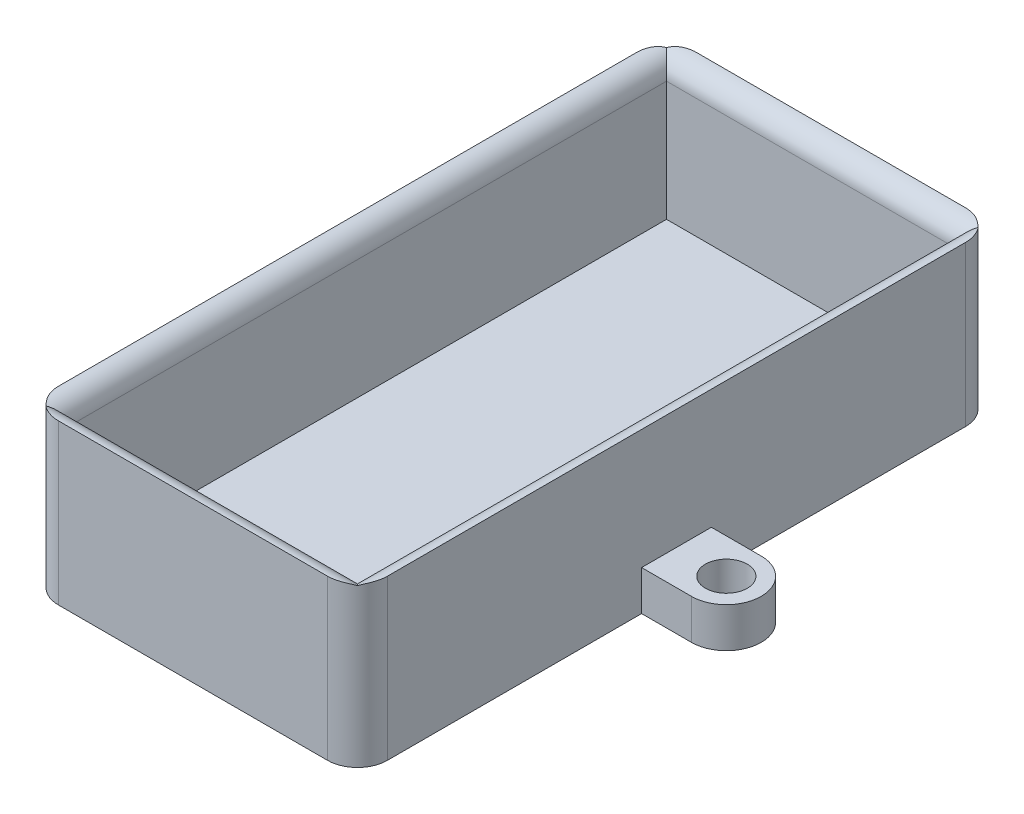
ISO-10303-21;
HEADER;
FILE_DESCRIPTION(('STEP AP214'),'2;1');
FILE_NAME('part.step','',(''),(''),'','','');
FILE_SCHEMA(('AUTOMOTIVE_DESIGN { 1 0 10303 214 1 1 1 1 }'));
ENDSEC;
DATA;
#1=APPLICATION_CONTEXT('core data for automotive mechanical design processes');
#2=APPLICATION_PROTOCOL_DEFINITION('international standard','automotive_design',2000,#1);
#3=PRODUCT_CONTEXT('',#1,'mechanical');
#4=PRODUCT('Part','Part','',(#3));
#5=PRODUCT_RELATED_PRODUCT_CATEGORY('part','',(#4));
#6=PRODUCT_DEFINITION_FORMATION('','',#4);
#7=PRODUCT_DEFINITION_CONTEXT('part definition',#1,'design');
#8=PRODUCT_DEFINITION('design','',#6,#7);
#9=PRODUCT_DEFINITION_SHAPE('','',#8);
#10=(LENGTH_UNIT() NAMED_UNIT(*) SI_UNIT(.MILLI.,.METRE.));
#11=(NAMED_UNIT(*) PLANE_ANGLE_UNIT() SI_UNIT($,.RADIAN.));
#12=(NAMED_UNIT(*) SI_UNIT($,.STERADIAN.) SOLID_ANGLE_UNIT());
#13=UNCERTAINTY_MEASURE_WITH_UNIT(LENGTH_MEASURE(1.E-05),#10,'distance_accuracy_value','');
#14=(GEOMETRIC_REPRESENTATION_CONTEXT(3) GLOBAL_UNCERTAINTY_ASSIGNED_CONTEXT((#13)) GLOBAL_UNIT_ASSIGNED_CONTEXT((#10,
#11,#12)) REPRESENTATION_CONTEXT('',''));
#15=CARTESIAN_POINT('',(0.,0.,0.));
#16=DIRECTION('',(0.,0.,1.));
#17=DIRECTION('',(1.,0.,0.));
#18=AXIS2_PLACEMENT_3D('',#15,#16,#17);
#19=CARTESIAN_POINT('',(16.5,14.,-32.));
#20=DIRECTION('',(-1.,0.,0.));
#21=DIRECTION('',(0.,0.,1.));
#22=AXIS2_PLACEMENT_3D('',#19,#20,#21);
#23=PLANE('',#22);
#24=DIRECTION('',(0.,0.,1.));
#25=VECTOR('',#24,1.);
#26=CARTESIAN_POINT('',(16.5,-2.,32.));
#27=LINE('',#26,#25);
#28=CARTESIAN_POINT('',(16.5,-2.,-29.));
#29=VERTEX_POINT('',#28);
#30=CARTESIAN_POINT('',(16.5,-2.,-3.5));
#31=VERTEX_POINT('',#30);
#32=EDGE_CURVE('E273',#29,#31,#27,.T.);
#33=ORIENTED_EDGE('',*,*,#32,.F.);
#34=DIRECTION('',(0.,-1.,0.));
#35=VECTOR('',#34,1.);
#36=CARTESIAN_POINT('',(16.5,14.,-29.));
#37=LINE('',#36,#35);
#38=CARTESIAN_POINT('',(16.5,14.,-29.));
#39=VERTEX_POINT('',#38);
#40=EDGE_CURVE('E327',#29,#39,#37,.F.);
#41=ORIENTED_EDGE('',*,*,#40,.T.);
#42=DIRECTION('',(0.,0.,-1.));
#43=VECTOR('',#42,1.);
#44=CARTESIAN_POINT('',(16.5,14.,-32.));
#45=LINE('',#44,#43);
#46=CARTESIAN_POINT('',(16.5,14.,29.));
#47=VERTEX_POINT('',#46);
#48=EDGE_CURVE('E298',#47,#39,#45,.T.);
#49=ORIENTED_EDGE('',*,*,#48,.F.);
#50=DIRECTION('',(0.,-1.,0.));
#51=VECTOR('',#50,1.);
#52=CARTESIAN_POINT('',(16.5,14.,29.));
#53=LINE('',#52,#51);
#54=CARTESIAN_POINT('',(16.5,-2.,29.));
#55=VERTEX_POINT('',#54);
#56=EDGE_CURVE('E324',#47,#55,#53,.T.);
#57=ORIENTED_EDGE('',*,*,#56,.T.);
#58=CARTESIAN_POINT('',(16.5,-2.,3.5));
#59=VERTEX_POINT('',#58);
#60=EDGE_CURVE('E272',#59,#55,#27,.T.);
#61=ORIENTED_EDGE('',*,*,#60,.F.);
#62=DIRECTION('',(0.,-1.,0.));
#63=VECTOR('',#62,1.);
#64=CARTESIAN_POINT('',(16.5,2.,3.5));
#65=LINE('',#64,#63);
#66=CARTESIAN_POINT('',(16.5,2.,3.5));
#67=VERTEX_POINT('',#66);
#68=EDGE_CURVE('E197',#67,#59,#65,.T.);
#69=ORIENTED_EDGE('',*,*,#68,.F.);
#70=DIRECTION('',(0.,0.,-1.));
#71=VECTOR('',#70,1.);
#72=CARTESIAN_POINT('',(16.5,2.,3.5));
#73=LINE('',#72,#71);
#74=CARTESIAN_POINT('',(16.5,2.,-3.5));
#75=VERTEX_POINT('',#74);
#76=EDGE_CURVE('E207',#67,#75,#73,.T.);
#77=ORIENTED_EDGE('',*,*,#76,.T.);
#78=DIRECTION('',(0.,-1.,0.));
#79=VECTOR('',#78,1.);
#80=CARTESIAN_POINT('',(16.5,2.,-3.5));
#81=LINE('',#80,#79);
#82=EDGE_CURVE('E227',#75,#31,#81,.T.);
#83=ORIENTED_EDGE('',*,*,#82,.T.);
#84=EDGE_LOOP('',(#33,#41,#49,#57,#61,#69,#77,#83));
#85=FACE_BOUND('',#84,.T.);
#86=ADVANCED_FACE('F33',(#85),#23,.F.);
#87=CARTESIAN_POINT('',(-16.5,14.,-32.));
#88=DIRECTION('',(1.,0.,0.));
#89=DIRECTION('',(0.,0.,-1.));
#90=AXIS2_PLACEMENT_3D('',#87,#88,#89);
#91=PLANE('',#90);
#92=DIRECTION('',(0.,0.,1.));
#93=VECTOR('',#92,1.);
#94=CARTESIAN_POINT('',(-16.5,14.,-32.));
#95=LINE('',#94,#93);
#96=CARTESIAN_POINT('',(-16.5,14.,-29.));
#97=VERTEX_POINT('',#96);
#98=CARTESIAN_POINT('',(-16.5,14.,29.));
#99=VERTEX_POINT('',#98);
#100=EDGE_CURVE('E304',#97,#99,#95,.T.);
#101=ORIENTED_EDGE('',*,*,#100,.F.);
#102=DIRECTION('',(0.,-1.,0.));
#103=VECTOR('',#102,1.);
#104=CARTESIAN_POINT('',(-16.5,14.,-29.));
#105=LINE('',#104,#103);
#106=CARTESIAN_POINT('',(-16.5,-2.,-29.));
#107=VERTEX_POINT('',#106);
#108=EDGE_CURVE('E333',#97,#107,#105,.T.);
#109=ORIENTED_EDGE('',*,*,#108,.T.);
#110=DIRECTION('',(0.,0.,-1.));
#111=VECTOR('',#110,1.);
#112=CARTESIAN_POINT('',(-16.5,-2.,32.));
#113=LINE('',#112,#111);
#114=CARTESIAN_POINT('',(-16.5,-2.,-3.5));
#115=VERTEX_POINT('',#114);
#116=EDGE_CURVE('E260',#115,#107,#113,.T.);
#117=ORIENTED_EDGE('',*,*,#116,.F.);
#118=DIRECTION('',(0.,-1.,0.));
#119=VECTOR('',#118,1.);
#120=CARTESIAN_POINT('',(-16.5,2.,-3.5));
#121=LINE('',#120,#119);
#122=CARTESIAN_POINT('',(-16.5,2.,-3.5));
#123=VERTEX_POINT('',#122);
#124=EDGE_CURVE('E264',#123,#115,#121,.T.);
#125=ORIENTED_EDGE('',*,*,#124,.F.);
#126=DIRECTION('',(0.,0.,1.));
#127=VECTOR('',#126,1.);
#128=CARTESIAN_POINT('',(-16.5,2.,3.5));
#129=LINE('',#128,#127);
#130=CARTESIAN_POINT('',(-16.5,2.,3.5));
#131=VERTEX_POINT('',#130);
#132=EDGE_CURVE('E244',#123,#131,#129,.T.);
#133=ORIENTED_EDGE('',*,*,#132,.T.);
#134=DIRECTION('',(0.,-1.,0.));
#135=VECTOR('',#134,1.);
#136=CARTESIAN_POINT('',(-16.5,2.,3.5));
#137=LINE('',#136,#135);
#138=CARTESIAN_POINT('',(-16.5,-2.,3.5));
#139=VERTEX_POINT('',#138);
#140=EDGE_CURVE('E261',#131,#139,#137,.T.);
#141=ORIENTED_EDGE('',*,*,#140,.T.);
#142=CARTESIAN_POINT('',(-16.5,-2.,29.));
#143=VERTEX_POINT('',#142);
#144=EDGE_CURVE('E267',#143,#139,#113,.T.);
#145=ORIENTED_EDGE('',*,*,#144,.F.);
#146=DIRECTION('',(0.,-1.,0.));
#147=VECTOR('',#146,1.);
#148=CARTESIAN_POINT('',(-16.5,14.,29.));
#149=LINE('',#148,#147);
#150=EDGE_CURVE('E330',#143,#99,#149,.F.);
#151=ORIENTED_EDGE('',*,*,#150,.T.);
#152=EDGE_LOOP('',(#101,#109,#117,#125,#133,#141,#145,#151));
#153=FACE_BOUND('',#152,.T.);
#154=ADVANCED_FACE('F501',(#153),#91,.F.);
#155=CARTESIAN_POINT('',(-16.5,14.,-32.));
#156=DIRECTION('',(0.,0.,1.));
#157=DIRECTION('',(1.,0.,0.));
#158=AXIS2_PLACEMENT_3D('',#155,#156,#157);
#159=PLANE('',#158);
#160=DIRECTION('',(-1.,0.,0.));
#161=VECTOR('',#160,1.);
#162=CARTESIAN_POINT('',(-16.5,14.,-32.));
#163=LINE('',#162,#161);
#164=CARTESIAN_POINT('',(13.5,14.,-32.));
#165=VERTEX_POINT('',#164);
#166=CARTESIAN_POINT('',(-13.5,14.,-32.));
#167=VERTEX_POINT('',#166);
#168=EDGE_CURVE('E301',#165,#167,#163,.T.);
#169=ORIENTED_EDGE('',*,*,#168,.F.);
#170=DIRECTION('',(0.,-1.,0.));
#171=VECTOR('',#170,1.);
#172=CARTESIAN_POINT('',(13.5,14.,-32.));
#173=LINE('',#172,#171);
#174=CARTESIAN_POINT('',(13.5,-2.,-32.));
#175=VERTEX_POINT('',#174);
#176=EDGE_CURVE('E313',#165,#175,#173,.T.);
#177=ORIENTED_EDGE('',*,*,#176,.T.);
#178=DIRECTION('',(1.,0.,0.));
#179=VECTOR('',#178,1.);
#180=CARTESIAN_POINT('',(-16.5,-2.,-32.));
#181=LINE('',#180,#179);
#182=CARTESIAN_POINT('',(-13.5,-2.,-32.));
#183=VERTEX_POINT('',#182);
#184=EDGE_CURVE('E269',#183,#175,#181,.T.);
#185=ORIENTED_EDGE('',*,*,#184,.F.);
#186=DIRECTION('',(0.,-1.,0.));
#187=VECTOR('',#186,1.);
#188=CARTESIAN_POINT('',(-13.5,14.,-32.));
#189=LINE('',#188,#187);
#190=EDGE_CURVE('E310',#183,#167,#189,.F.);
#191=ORIENTED_EDGE('',*,*,#190,.T.);
#192=EDGE_LOOP('',(#169,#177,#185,#191));
#193=FACE_BOUND('',#192,.T.);
#194=ADVANCED_FACE('F431',(#193),#159,.F.);
#195=CARTESIAN_POINT('',(-16.5,14.,32.));
#196=DIRECTION('',(0.,0.,-1.));
#197=DIRECTION('',(-1.,0.,0.));
#198=AXIS2_PLACEMENT_3D('',#195,#196,#197);
#199=PLANE('',#198);
#200=DIRECTION('',(-1.,0.,0.));
#201=VECTOR('',#200,1.);
#202=CARTESIAN_POINT('',(-16.5,-2.,32.));
#203=LINE('',#202,#201);
#204=CARTESIAN_POINT('',(13.5,-2.,32.));
#205=VERTEX_POINT('',#204);
#206=CARTESIAN_POINT('',(-13.5,-2.,32.));
#207=VERTEX_POINT('',#206);
#208=EDGE_CURVE('E275',#205,#207,#203,.T.);
#209=ORIENTED_EDGE('',*,*,#208,.F.);
#210=DIRECTION('',(0.,-1.,0.));
#211=VECTOR('',#210,1.);
#212=CARTESIAN_POINT('',(13.5,14.,32.));
#213=LINE('',#212,#211);
#214=CARTESIAN_POINT('',(13.5,14.,32.));
#215=VERTEX_POINT('',#214);
#216=EDGE_CURVE('E339',#205,#215,#213,.F.);
#217=ORIENTED_EDGE('',*,*,#216,.T.);
#218=DIRECTION('',(1.,0.,0.));
#219=VECTOR('',#218,1.);
#220=CARTESIAN_POINT('',(-16.5,14.,32.));
#221=LINE('',#220,#219);
#222=CARTESIAN_POINT('',(-13.5,14.,32.));
#223=VERTEX_POINT('',#222);
#224=EDGE_CURVE('E307',#223,#215,#221,.T.);
#225=ORIENTED_EDGE('',*,*,#224,.F.);
#226=DIRECTION('',(0.,-1.,0.));
#227=VECTOR('',#226,1.);
#228=CARTESIAN_POINT('',(-13.5,14.,32.));
#229=LINE('',#228,#227);
#230=EDGE_CURVE('E336',#223,#207,#229,.T.);
#231=ORIENTED_EDGE('',*,*,#230,.T.);
#232=EDGE_LOOP('',(#209,#217,#225,#231));
#233=FACE_BOUND('',#232,.T.);
#234=ADVANCED_FACE('F451',(#233),#199,.F.);
#235=CARTESIAN_POINT('',(14.5,14.,-30.));
#236=DIRECTION('',(-1.,0.,0.));
#237=DIRECTION('',(0.,0.,1.));
#238=AXIS2_PLACEMENT_3D('',#235,#236,#237);
#239=PLANE('',#238);
#240=DIRECTION('',(0.,-1.,0.));
#241=VECTOR('',#240,1.);
#242=CARTESIAN_POINT('',(14.5,14.,30.));
#243=LINE('',#242,#241);
#244=CARTESIAN_POINT('',(14.5,12.,30.));
#245=VERTEX_POINT('',#244);
#246=CARTESIAN_POINT('',(14.5,0.,30.));
#247=VERTEX_POINT('',#246);
#248=EDGE_CURVE('E290',#245,#247,#243,.T.);
#249=ORIENTED_EDGE('',*,*,#248,.F.);
#250=DIRECTION('',(0.,0.,-1.));
#251=VECTOR('',#250,1.);
#252=CARTESIAN_POINT('',(14.5,12.,-30.));
#253=LINE('',#252,#251);
#254=CARTESIAN_POINT('',(14.5,12.,-30.));
#255=VERTEX_POINT('',#254);
#256=EDGE_CURVE('E342',#245,#255,#253,.T.);
#257=ORIENTED_EDGE('',*,*,#256,.T.);
#258=DIRECTION('',(0.,-1.,0.));
#259=VECTOR('',#258,1.);
#260=CARTESIAN_POINT('',(14.5,14.,-30.));
#261=LINE('',#260,#259);
#262=CARTESIAN_POINT('',(14.5,0.,-30.));
#263=VERTEX_POINT('',#262);
#264=EDGE_CURVE('E296',#255,#263,#261,.T.);
#265=ORIENTED_EDGE('',*,*,#264,.T.);
#266=DIRECTION('',(0.,0.,-1.));
#267=VECTOR('',#266,1.);
#268=CARTESIAN_POINT('',(14.5,0.,-30.));
#269=LINE('',#268,#267);
#270=EDGE_CURVE('E278',#247,#263,#269,.T.);
#271=ORIENTED_EDGE('',*,*,#270,.F.);
#272=EDGE_LOOP('',(#249,#257,#265,#271));
#273=FACE_BOUND('',#272,.T.);
#274=ADVANCED_FACE('F475',(#273),#239,.T.);
#275=CARTESIAN_POINT('',(-14.5,14.,-30.));
#276=DIRECTION('',(0.,0.,1.));
#277=DIRECTION('',(1.,0.,0.));
#278=AXIS2_PLACEMENT_3D('',#275,#276,#277);
#279=PLANE('',#278);
#280=ORIENTED_EDGE('',*,*,#264,.F.);
#281=DIRECTION('',(-1.,0.,0.));
#282=VECTOR('',#281,1.);
#283=CARTESIAN_POINT('',(-14.5,12.,-30.));
#284=LINE('',#283,#282);
#285=CARTESIAN_POINT('',(-14.5,12.,-30.));
#286=VERTEX_POINT('',#285);
#287=EDGE_CURVE('E413',#255,#286,#284,.T.);
#288=ORIENTED_EDGE('',*,*,#287,.T.);
#289=DIRECTION('',(0.,-1.,0.));
#290=VECTOR('',#289,1.);
#291=CARTESIAN_POINT('',(-14.5,14.,-30.));
#292=LINE('',#291,#290);
#293=CARTESIAN_POINT('',(-14.5,0.,-30.));
#294=VERTEX_POINT('',#293);
#295=EDGE_CURVE('E294',#286,#294,#292,.T.);
#296=ORIENTED_EDGE('',*,*,#295,.T.);
#297=DIRECTION('',(-1.,0.,0.));
#298=VECTOR('',#297,1.);
#299=CARTESIAN_POINT('',(-14.5,0.,-30.));
#300=LINE('',#299,#298);
#301=EDGE_CURVE('E281',#263,#294,#300,.T.);
#302=ORIENTED_EDGE('',*,*,#301,.F.);
#303=EDGE_LOOP('',(#280,#288,#296,#302));
#304=FACE_BOUND('',#303,.T.);
#305=ADVANCED_FACE('F478',(#304),#279,.T.);
#306=CARTESIAN_POINT('',(-14.5,14.,-30.));
#307=DIRECTION('',(1.,0.,0.));
#308=DIRECTION('',(0.,0.,-1.));
#309=AXIS2_PLACEMENT_3D('',#306,#307,#308);
#310=PLANE('',#309);
#311=ORIENTED_EDGE('',*,*,#295,.F.);
#312=DIRECTION('',(0.,0.,1.));
#313=VECTOR('',#312,1.);
#314=CARTESIAN_POINT('',(-14.5,12.,-30.));
#315=LINE('',#314,#313);
#316=CARTESIAN_POINT('',(-14.5,12.,30.));
#317=VERTEX_POINT('',#316);
#318=EDGE_CURVE('E59',#286,#317,#315,.T.);
#319=ORIENTED_EDGE('',*,*,#318,.T.);
#320=DIRECTION('',(0.,-1.,0.));
#321=VECTOR('',#320,1.);
#322=CARTESIAN_POINT('',(-14.5,14.,30.));
#323=LINE('',#322,#321);
#324=CARTESIAN_POINT('',(-14.5,0.,30.));
#325=VERTEX_POINT('',#324);
#326=EDGE_CURVE('E292',#317,#325,#323,.T.);
#327=ORIENTED_EDGE('',*,*,#326,.T.);
#328=DIRECTION('',(0.,0.,1.));
#329=VECTOR('',#328,1.);
#330=CARTESIAN_POINT('',(-14.5,0.,-30.));
#331=LINE('',#330,#329);
#332=EDGE_CURVE('E284',#294,#325,#331,.T.);
#333=ORIENTED_EDGE('',*,*,#332,.F.);
#334=EDGE_LOOP('',(#311,#319,#327,#333));
#335=FACE_BOUND('',#334,.T.);
#336=ADVANCED_FACE('F516',(#335),#310,.T.);
#337=CARTESIAN_POINT('',(-14.5,14.,30.));
#338=DIRECTION('',(0.,0.,-1.));
#339=DIRECTION('',(-1.,0.,0.));
#340=AXIS2_PLACEMENT_3D('',#337,#338,#339);
#341=PLANE('',#340);
#342=ORIENTED_EDGE('',*,*,#326,.F.);
#343=DIRECTION('',(1.,0.,0.));
#344=VECTOR('',#343,1.);
#345=CARTESIAN_POINT('',(-14.5,12.,30.));
#346=LINE('',#345,#344);
#347=EDGE_CURVE('E11',#317,#245,#346,.T.);
#348=ORIENTED_EDGE('',*,*,#347,.T.);
#349=ORIENTED_EDGE('',*,*,#248,.T.);
#350=DIRECTION('',(1.,0.,0.));
#351=VECTOR('',#350,1.);
#352=CARTESIAN_POINT('',(-14.5,0.,30.));
#353=LINE('',#352,#351);
#354=EDGE_CURVE('E287',#325,#247,#353,.T.);
#355=ORIENTED_EDGE('',*,*,#354,.F.);
#356=EDGE_LOOP('',(#342,#348,#349,#355));
#357=FACE_BOUND('',#356,.T.);
#358=ADVANCED_FACE('F484',(#357),#341,.T.);
#359=CARTESIAN_POINT('',(0.,0.,0.));
#360=DIRECTION('',(0.,-1.,0.));
#361=DIRECTION('',(0.,0.,-1.));
#362=AXIS2_PLACEMENT_3D('',#359,#360,#361);
#363=PLANE('',#362);
#364=ORIENTED_EDGE('',*,*,#354,.T.);
#365=ORIENTED_EDGE('',*,*,#270,.T.);
#366=ORIENTED_EDGE('',*,*,#301,.T.);
#367=ORIENTED_EDGE('',*,*,#332,.T.);
#368=EDGE_LOOP('',(#364,#365,#366,#367));
#369=FACE_BOUND('',#368,.T.);
#370=ADVANCED_FACE('F481',(#369),#363,.F.);
#371=CARTESIAN_POINT('',(0.,-2.,0.));
#372=DIRECTION('',(0.,-1.,0.));
#373=DIRECTION('',(0.,0.,-1.));
#374=AXIS2_PLACEMENT_3D('',#371,#372,#373);
#375=PLANE('',#374);
#376=ORIENTED_EDGE('',*,*,#184,.T.);
#377=CARTESIAN_POINT('',(13.5,-2.,-29.));
#378=DIRECTION('',(0.,-1.,0.));
#379=DIRECTION('',(0.,0.,-1.));
#380=AXIS2_PLACEMENT_3D('',#377,#378,#379);
#381=CIRCLE('',#380,3.);
#382=EDGE_CURVE('E322',#175,#29,#381,.T.);
#383=ORIENTED_EDGE('',*,*,#382,.T.);
#384=ORIENTED_EDGE('',*,*,#32,.T.);
#385=DIRECTION('',(1.,0.,0.));
#386=VECTOR('',#385,1.);
#387=CARTESIAN_POINT('',(21.5,-2.,-3.5));
#388=LINE('',#387,#386);
#389=CARTESIAN_POINT('',(21.5,-2.,-3.5));
#390=VERTEX_POINT('',#389);
#391=EDGE_CURVE('E211',#31,#390,#388,.T.);
#392=ORIENTED_EDGE('',*,*,#391,.T.);
#393=CARTESIAN_POINT('',(21.5,-2.,0.));
#394=DIRECTION('',(0.,-1.,0.));
#395=DIRECTION('',(0.,0.,1.));
#396=AXIS2_PLACEMENT_3D('',#393,#394,#395);
#397=CIRCLE('',#396,3.5);
#398=CARTESIAN_POINT('',(21.5,-2.,3.5));
#399=VERTEX_POINT('',#398);
#400=EDGE_CURVE('E221',#390,#399,#397,.T.);
#401=ORIENTED_EDGE('',*,*,#400,.T.);
#402=DIRECTION('',(-1.,0.,0.));
#403=VECTOR('',#402,1.);
#404=CARTESIAN_POINT('',(21.5,-2.,3.5));
#405=LINE('',#404,#403);
#406=EDGE_CURVE('E192',#399,#59,#405,.T.);
#407=ORIENTED_EDGE('',*,*,#406,.T.);
#408=ORIENTED_EDGE('',*,*,#60,.T.);
#409=CARTESIAN_POINT('',(13.5,-2.,29.));
#410=DIRECTION('',(0.,-1.,0.));
#411=DIRECTION('',(0.,0.,-1.));
#412=AXIS2_PLACEMENT_3D('',#409,#410,#411);
#413=CIRCLE('',#412,3.);
#414=EDGE_CURVE('E318',#55,#205,#413,.T.);
#415=ORIENTED_EDGE('',*,*,#414,.T.);
#416=ORIENTED_EDGE('',*,*,#208,.T.);
#417=CARTESIAN_POINT('',(-13.5,-2.,29.));
#418=DIRECTION('',(0.,-1.,0.));
#419=DIRECTION('',(0.,0.,-1.));
#420=AXIS2_PLACEMENT_3D('',#417,#418,#419);
#421=CIRCLE('',#420,3.);
#422=EDGE_CURVE('E316',#207,#143,#421,.T.);
#423=ORIENTED_EDGE('',*,*,#422,.T.);
#424=ORIENTED_EDGE('',*,*,#144,.T.);
#425=DIRECTION('',(-1.,0.,0.));
#426=VECTOR('',#425,1.);
#427=CARTESIAN_POINT('',(-21.5,-2.,3.5));
#428=LINE('',#427,#426);
#429=CARTESIAN_POINT('',(-21.5,-2.,3.5));
#430=VERTEX_POINT('',#429);
#431=EDGE_CURVE('E241',#139,#430,#428,.T.);
#432=ORIENTED_EDGE('',*,*,#431,.T.);
#433=CARTESIAN_POINT('',(-21.5,-2.,0.));
#434=DIRECTION('',(0.,-1.,0.));
#435=DIRECTION('',(0.,0.,-1.));
#436=AXIS2_PLACEMENT_3D('',#433,#434,#435);
#437=CIRCLE('',#436,3.5);
#438=CARTESIAN_POINT('',(-21.5,-2.,-3.5));
#439=VERTEX_POINT('',#438);
#440=EDGE_CURVE('E234',#430,#439,#437,.T.);
#441=ORIENTED_EDGE('',*,*,#440,.T.);
#442=DIRECTION('',(1.,0.,0.));
#443=VECTOR('',#442,1.);
#444=CARTESIAN_POINT('',(-21.5,-2.,-3.5));
#445=LINE('',#444,#443);
#446=EDGE_CURVE('E253',#439,#115,#445,.T.);
#447=ORIENTED_EDGE('',*,*,#446,.T.);
#448=ORIENTED_EDGE('',*,*,#116,.T.);
#449=CARTESIAN_POINT('',(-13.5,-2.,-29.));
#450=DIRECTION('',(0.,-1.,0.));
#451=DIRECTION('',(0.,0.,-1.));
#452=AXIS2_PLACEMENT_3D('',#449,#450,#451);
#453=CIRCLE('',#452,3.);
#454=EDGE_CURVE('E320',#107,#183,#453,.T.);
#455=ORIENTED_EDGE('',*,*,#454,.T.);
#456=EDGE_LOOP('',(#376,#383,#384,#392,#401,#407,#408,#415,#416,#423,#424,#432,#441,#447,#448,#455));
#457=FACE_BOUND('',#456,.T.);
#458=CARTESIAN_POINT('',(-21.5,-2.,0.));
#459=DIRECTION('',(0.,-1.,0.));
#460=DIRECTION('',(0.,0.,-1.));
#461=AXIS2_PLACEMENT_3D('',#458,#459,#460);
#462=CIRCLE('',#461,2.1);
#463=CARTESIAN_POINT('',(-21.5,-2.,-2.1));
#464=VERTEX_POINT('',#463);
#465=EDGE_CURVE('E226',#464,#464,#462,.T.);
#466=ORIENTED_EDGE('',*,*,#465,.F.);
#467=EDGE_LOOP('',(#466));
#468=FACE_BOUND('',#467,.T.);
#469=CARTESIAN_POINT('',(21.5,-2.,0.));
#470=DIRECTION('',(0.,-1.,0.));
#471=DIRECTION('',(0.,0.,1.));
#472=AXIS2_PLACEMENT_3D('',#469,#470,#471);
#473=CIRCLE('',#472,2.1);
#474=CARTESIAN_POINT('',(21.5,-2.,2.1));
#475=VERTEX_POINT('',#474);
#476=EDGE_CURVE('E216',#475,#475,#473,.T.);
#477=ORIENTED_EDGE('',*,*,#476,.F.);
#478=EDGE_LOOP('',(#477));
#479=FACE_BOUND('',#478,.T.);
#480=ADVANCED_FACE('F437',(#457,#468,#479),#375,.T.);
#481=CARTESIAN_POINT('',(-21.5,2.,0.));
#482=DIRECTION('',(0.,-1.,0.));
#483=DIRECTION('',(0.,0.,-1.));
#484=AXIS2_PLACEMENT_3D('',#481,#482,#483);
#485=CYLINDRICAL_SURFACE('',#484,3.5);
#486=ORIENTED_EDGE('',*,*,#440,.F.);
#487=DIRECTION('',(0.,-1.,0.));
#488=VECTOR('',#487,1.);
#489=CARTESIAN_POINT('',(-21.5,2.,3.5));
#490=LINE('',#489,#488);
#491=CARTESIAN_POINT('',(-21.5,2.,3.5));
#492=VERTEX_POINT('',#491);
#493=EDGE_CURVE('E258',#492,#430,#490,.T.);
#494=ORIENTED_EDGE('',*,*,#493,.F.);
#495=CARTESIAN_POINT('',(-21.5,2.,0.));
#496=DIRECTION('',(0.,-1.,0.));
#497=DIRECTION('',(0.,0.,-1.));
#498=AXIS2_PLACEMENT_3D('',#495,#496,#497);
#499=CIRCLE('',#498,3.5);
#500=CARTESIAN_POINT('',(-21.5,2.,-3.5));
#501=VERTEX_POINT('',#500);
#502=EDGE_CURVE('E237',#492,#501,#499,.T.);
#503=ORIENTED_EDGE('',*,*,#502,.T.);
#504=DIRECTION('',(0.,-1.,0.));
#505=VECTOR('',#504,1.);
#506=CARTESIAN_POINT('',(-21.5,2.,-3.5));
#507=LINE('',#506,#505);
#508=EDGE_CURVE('E250',#501,#439,#507,.T.);
#509=ORIENTED_EDGE('',*,*,#508,.T.);
#510=EDGE_LOOP('',(#486,#494,#503,#509));
#511=FACE_BOUND('',#510,.T.);
#512=ADVANCED_FACE('F525',(#511),#485,.T.);
#513=CARTESIAN_POINT('',(-21.5,2.,3.5));
#514=DIRECTION('',(0.,0.,1.));
#515=DIRECTION('',(1.,0.,0.));
#516=AXIS2_PLACEMENT_3D('',#513,#514,#515);
#517=PLANE('',#516);
#518=ORIENTED_EDGE('',*,*,#431,.F.);
#519=ORIENTED_EDGE('',*,*,#140,.F.);
#520=DIRECTION('',(-1.,0.,0.));
#521=VECTOR('',#520,1.);
#522=CARTESIAN_POINT('',(-21.5,2.,3.5));
#523=LINE('',#522,#521);
#524=EDGE_CURVE('E247',#131,#492,#523,.T.);
#525=ORIENTED_EDGE('',*,*,#524,.T.);
#526=ORIENTED_EDGE('',*,*,#493,.T.);
#527=EDGE_LOOP('',(#518,#519,#525,#526));
#528=FACE_BOUND('',#527,.T.);
#529=ADVANCED_FACE('F528',(#528),#517,.T.);
#530=CARTESIAN_POINT('',(-21.5,2.,-3.5));
#531=DIRECTION('',(0.,0.,-1.));
#532=DIRECTION('',(-1.,0.,0.));
#533=AXIS2_PLACEMENT_3D('',#530,#531,#532);
#534=PLANE('',#533);
#535=ORIENTED_EDGE('',*,*,#446,.F.);
#536=ORIENTED_EDGE('',*,*,#508,.F.);
#537=DIRECTION('',(1.,0.,0.));
#538=VECTOR('',#537,1.);
#539=CARTESIAN_POINT('',(-21.5,2.,-3.5));
#540=LINE('',#539,#538);
#541=EDGE_CURVE('E240',#501,#123,#540,.T.);
#542=ORIENTED_EDGE('',*,*,#541,.T.);
#543=ORIENTED_EDGE('',*,*,#124,.T.);
#544=EDGE_LOOP('',(#535,#536,#542,#543));
#545=FACE_BOUND('',#544,.T.);
#546=ADVANCED_FACE('F530',(#545),#534,.T.);
#547=CARTESIAN_POINT('',(-21.5,2.,0.));
#548=DIRECTION('',(0.,-1.,0.));
#549=DIRECTION('',(0.,0.,-1.));
#550=AXIS2_PLACEMENT_3D('',#547,#548,#549);
#551=PLANE('',#550);
#552=CARTESIAN_POINT('',(-21.5,2.,0.));
#553=DIRECTION('',(0.,-1.,0.));
#554=DIRECTION('',(0.,0.,-1.));
#555=AXIS2_PLACEMENT_3D('',#552,#553,#554);
#556=CIRCLE('',#555,2.1);
#557=CARTESIAN_POINT('',(-21.5,2.,-2.1));
#558=VERTEX_POINT('',#557);
#559=EDGE_CURVE('E231',#558,#558,#556,.T.);
#560=ORIENTED_EDGE('',*,*,#559,.T.);
#561=EDGE_LOOP('',(#560));
#562=FACE_BOUND('',#561,.T.);
#563=ORIENTED_EDGE('',*,*,#502,.F.);
#564=ORIENTED_EDGE('',*,*,#524,.F.);
#565=ORIENTED_EDGE('',*,*,#132,.F.);
#566=ORIENTED_EDGE('',*,*,#541,.F.);
#567=EDGE_LOOP('',(#563,#564,#565,#566));
#568=FACE_BOUND('',#567,.T.);
#569=ADVANCED_FACE('F533',(#562,#568),#551,.F.);
#570=CARTESIAN_POINT('',(-21.5,2.,0.));
#571=DIRECTION('',(0.,-1.,0.));
#572=DIRECTION('',(0.,0.,-1.));
#573=AXIS2_PLACEMENT_3D('',#570,#571,#572);
#574=CYLINDRICAL_SURFACE('',#573,2.1);
#575=ORIENTED_EDGE('',*,*,#559,.F.);
#576=EDGE_LOOP('',(#575));
#577=FACE_BOUND('',#576,.T.);
#578=ORIENTED_EDGE('',*,*,#465,.T.);
#579=EDGE_LOOP('',(#578));
#580=FACE_BOUND('',#579,.T.);
#581=ADVANCED_FACE('F540',(#577,#580),#574,.F.);
#582=CARTESIAN_POINT('',(21.5,2.,0.));
#583=DIRECTION('',(0.,-1.,0.));
#584=DIRECTION('',(0.,0.,-1.));
#585=AXIS2_PLACEMENT_3D('',#582,#583,#584);
#586=CYLINDRICAL_SURFACE('',#585,3.5);
#587=ORIENTED_EDGE('',*,*,#400,.F.);
#588=DIRECTION('',(0.,-1.,0.));
#589=VECTOR('',#588,1.);
#590=CARTESIAN_POINT('',(21.5,2.,-3.5));
#591=LINE('',#590,#589);
#592=CARTESIAN_POINT('',(21.5,2.,-3.5));
#593=VERTEX_POINT('',#592);
#594=EDGE_CURVE('E210',#593,#390,#591,.T.);
#595=ORIENTED_EDGE('',*,*,#594,.F.);
#596=CARTESIAN_POINT('',(21.5,2.,0.));
#597=DIRECTION('',(0.,-1.,0.));
#598=DIRECTION('',(0.,0.,1.));
#599=AXIS2_PLACEMENT_3D('',#596,#597,#598);
#600=CIRCLE('',#599,3.5);
#601=CARTESIAN_POINT('',(21.5,2.,3.5));
#602=VERTEX_POINT('',#601);
#603=EDGE_CURVE('E204',#593,#602,#600,.T.);
#604=ORIENTED_EDGE('',*,*,#603,.T.);
#605=DIRECTION('',(0.,-1.,0.));
#606=VECTOR('',#605,1.);
#607=CARTESIAN_POINT('',(21.5,2.,3.5));
#608=LINE('',#607,#606);
#609=EDGE_CURVE('E186',#602,#399,#608,.T.);
#610=ORIENTED_EDGE('',*,*,#609,.T.);
#611=EDGE_LOOP('',(#587,#595,#604,#610));
#612=FACE_BOUND('',#611,.T.);
#613=ADVANCED_FACE('F209',(#612),#586,.T.);
#614=CARTESIAN_POINT('',(21.5,2.,-3.5));
#615=DIRECTION('',(0.,0.,-1.));
#616=DIRECTION('',(-1.,0.,0.));
#617=AXIS2_PLACEMENT_3D('',#614,#615,#616);
#618=PLANE('',#617);
#619=ORIENTED_EDGE('',*,*,#391,.F.);
#620=ORIENTED_EDGE('',*,*,#82,.F.);
#621=DIRECTION('',(1.,0.,0.));
#622=VECTOR('',#621,1.);
#623=CARTESIAN_POINT('',(21.5,2.,-3.5));
#624=LINE('',#623,#622);
#625=EDGE_CURVE('E198',#75,#593,#624,.T.);
#626=ORIENTED_EDGE('',*,*,#625,.T.);
#627=ORIENTED_EDGE('',*,*,#594,.T.);
#628=EDGE_LOOP('',(#619,#620,#626,#627));
#629=FACE_BOUND('',#628,.T.);
#630=ADVANCED_FACE('F443',(#629),#618,.T.);
#631=CARTESIAN_POINT('',(21.5,2.,3.5));
#632=DIRECTION('',(0.,0.,1.));
#633=DIRECTION('',(1.,0.,0.));
#634=AXIS2_PLACEMENT_3D('',#631,#632,#633);
#635=PLANE('',#634);
#636=ORIENTED_EDGE('',*,*,#406,.F.);
#637=ORIENTED_EDGE('',*,*,#609,.F.);
#638=DIRECTION('',(-1.,0.,0.));
#639=VECTOR('',#638,1.);
#640=CARTESIAN_POINT('',(21.5,2.,3.5));
#641=LINE('',#640,#639);
#642=EDGE_CURVE('E189',#602,#67,#641,.T.);
#643=ORIENTED_EDGE('',*,*,#642,.T.);
#644=ORIENTED_EDGE('',*,*,#68,.T.);
#645=EDGE_LOOP('',(#636,#637,#643,#644));
#646=FACE_BOUND('',#645,.T.);
#647=ADVANCED_FACE('F188',(#646),#635,.T.);
#648=CARTESIAN_POINT('',(21.5,2.,0.));
#649=DIRECTION('',(0.,1.,0.));
#650=DIRECTION('',(0.,0.,1.));
#651=AXIS2_PLACEMENT_3D('',#648,#649,#650);
#652=PLANE('',#651);
#653=CARTESIAN_POINT('',(21.5,2.,0.));
#654=DIRECTION('',(0.,-1.,0.));
#655=DIRECTION('',(0.,0.,1.));
#656=AXIS2_PLACEMENT_3D('',#653,#654,#655);
#657=CIRCLE('',#656,2.1);
#658=CARTESIAN_POINT('',(21.5,2.,2.1));
#659=VERTEX_POINT('',#658);
#660=EDGE_CURVE('E223',#659,#659,#657,.T.);
#661=ORIENTED_EDGE('',*,*,#660,.T.);
#662=EDGE_LOOP('',(#661));
#663=FACE_BOUND('',#662,.T.);
#664=ORIENTED_EDGE('',*,*,#603,.F.);
#665=ORIENTED_EDGE('',*,*,#625,.F.);
#666=ORIENTED_EDGE('',*,*,#76,.F.);
#667=ORIENTED_EDGE('',*,*,#642,.F.);
#668=EDGE_LOOP('',(#664,#665,#666,#667));
#669=FACE_BOUND('',#668,.T.);
#670=ADVANCED_FACE('F202',(#663,#669),#652,.T.);
#671=CARTESIAN_POINT('',(21.5,2.,0.));
#672=DIRECTION('',(0.,-1.,0.));
#673=DIRECTION('',(0.,0.,-1.));
#674=AXIS2_PLACEMENT_3D('',#671,#672,#673);
#675=CYLINDRICAL_SURFACE('',#674,2.1);
#676=ORIENTED_EDGE('',*,*,#660,.F.);
#677=EDGE_LOOP('',(#676));
#678=FACE_BOUND('',#677,.T.);
#679=ORIENTED_EDGE('',*,*,#476,.T.);
#680=EDGE_LOOP('',(#679));
#681=FACE_BOUND('',#680,.T.);
#682=ADVANCED_FACE('F492',(#678,#681),#675,.F.);
#683=CARTESIAN_POINT('',(13.5,14.,-29.));
#684=DIRECTION('',(0.,-1.,0.));
#685=DIRECTION('',(0.,0.,-1.));
#686=AXIS2_PLACEMENT_3D('',#683,#684,#685);
#687=CYLINDRICAL_SURFACE('',#686,3.);
#688=CARTESIAN_POINT('',(13.5,14.,-32.));
#689=CARTESIAN_POINT('',(13.5846065271603,13.9999593433504,-32.0000091469539));
#690=CARTESIAN_POINT('',(13.669211686239,13.999998730219,-31.9964212402013));
#691=CARTESIAN_POINT('',(13.8378272708385,13.9999436911634,-31.9821163311987));
#692=CARTESIAN_POINT('',(13.921837625234,13.9998492494992,-31.9713984904469));
#693=CARTESIAN_POINT('',(14.0893460433624,13.9992299567272,-31.9427800787386));
#694=CARTESIAN_POINT('',(14.172834013822,13.9987015276458,-31.9248204321395));
#695=CARTESIAN_POINT('',(14.3379596044148,13.9966240387787,-31.8818569864367));
#696=CARTESIAN_POINT('',(14.4195973802582,13.9950750652132,-31.8568537825063));
#697=CARTESIAN_POINT('',(14.5797412762635,13.9901992646866,-31.8002342875355));
#698=CARTESIAN_POINT('',(14.6582676321572,13.986887166075,-31.7686740834086));
#699=CARTESIAN_POINT('',(14.8122385413398,13.9775472244815,-31.6991041900448));
#700=CARTESIAN_POINT('',(14.8876836141928,13.9715198414286,-31.6610955937495));
#701=CARTESIAN_POINT('',(15.0343416594795,13.9556934836586,-31.5793021581003));
#702=CARTESIAN_POINT('',(15.1055784609714,13.9459186984783,-31.5355555254343));
#703=CARTESIAN_POINT('',(15.2435341552207,13.9213960997871,-31.4427418443036));
#704=CARTESIAN_POINT('',(15.3102572780533,13.9066530221551,-31.3936798926167));
#705=CARTESIAN_POINT('',(15.4180866052535,13.8766125360165,-31.3073975929452));
#706=CARTESIAN_POINT('',(15.4606053826147,13.8629741767701,-31.2713571636922));
#707=CARTESIAN_POINT('',(15.5430215095957,13.832387795602,-31.1975321611019));
#708=CARTESIAN_POINT('',(15.5829129404458,13.8154326211253,-31.1597439556834));
#709=CARTESIAN_POINT('',(15.6213203435596,13.7966418845607,-31.1213203435596));
#710=B_SPLINE_CURVE_WITH_KNOTS('',3,(#688,#689,#690,#691,#692,#693,#694,#695,#696,#697,#698,
#699,#700,#701,#702,#703,#704,#705,#706,#707,#708,#709),.UNSPECIFIED.,.F.,.F.,(4,2,2,2,2,2,2,2,
2,2,4),(0.,0.253741527701469,0.50751290144983,0.763397726949172,1.0192609369314,
1.27301957039842,1.52673523706032,1.7788400142401,2.03070515651122,2.20268303904215,
2.37503595534065),.UNSPECIFIED.);
#711=CARTESIAN_POINT('',(15.6213203435596,13.7966418845607,-31.1213203435596));
#712=VERTEX_POINT('',#711);
#713=EDGE_CURVE('E345',#165,#712,#710,.T.);
#714=ORIENTED_EDGE('',*,*,#713,.T.);
#715=CARTESIAN_POINT('',(15.6213203435596,13.7966418845607,-31.1213203435596));
#716=CARTESIAN_POINT('',(15.6669755820906,13.8189672912212,-31.0757001424394));
#717=CARTESIAN_POINT('',(15.711720856283,13.8386985701109,-31.0279756621899));
#718=CARTESIAN_POINT('',(15.7986794770629,13.873590862716,-30.9288272089484));
#719=CARTESIAN_POINT('',(15.8408964833002,13.8887586167744,-30.8774088324017));
#720=CARTESIAN_POINT('',(15.9219380386643,13.9151106823245,-30.7716194469008));
#721=CARTESIAN_POINT('',(15.9607844897939,13.9263224357358,-30.7172719194659));
#722=CARTESIAN_POINT('',(16.034995114884,13.9455687563171,-30.6057065855318));
#723=CARTESIAN_POINT('',(16.0703580711662,13.9536022154326,-30.5484877858359));
#724=CARTESIAN_POINT('',(16.1703367262689,13.9738162693157,-30.3737575116041));
#725=CARTESIAN_POINT('',(16.2293291359363,13.9822507870325,-30.2525380165038));
#726=CARTESIAN_POINT('',(16.3306465264238,13.9934728760948,-30.0028268854554));
#727=CARTESIAN_POINT('',(16.3729333945176,13.9962475942452,-29.8743193768263));
#728=CARTESIAN_POINT('',(16.4219206241098,13.9985324717739,-29.6828766958127));
#729=CARTESIAN_POINT('',(16.4355548340928,13.9989950183466,-29.6216526100423));
#730=CARTESIAN_POINT('',(16.4589632327745,13.9996139349789,-29.4984620089366));
#731=CARTESIAN_POINT('',(16.4687375930535,13.9997703186496,-29.4364955267291));
#732=CARTESIAN_POINT('',(16.4843632517214,13.9999547290136,-29.3122302949795));
#733=CARTESIAN_POINT('',(16.4902243240529,13.9999830765237,-29.249932767937));
#734=CARTESIAN_POINT('',(16.4980439913021,13.9999997193887,-29.1250906761643));
#735=CARTESIAN_POINT('',(16.5000024228895,13.9999880130674,-29.0625461012047));
#736=CARTESIAN_POINT('',(16.5,14.,-29.));
#737=B_SPLINE_CURVE_WITH_KNOTS('',3,(#715,#716,#717,#718,#719,#720,#721,#722,#723,#724,#725,
#726,#727,#728,#729,#730,#731,#732,#733,#734,#735,#736),.UNSPECIFIED.,.F.,.F.,(4,2,2,2,2,2,2,2,
2,2,4),(0.,0.204721577081597,0.409139278245762,0.612109731866483,0.815150885226564,
1.2188249892875,1.62341480620967,1.81149157380279,1.99955997994791,2.1871568860387,
2.3747616431289),.UNSPECIFIED.);
#738=EDGE_CURVE('E353',#712,#39,#737,.T.);
#739=ORIENTED_EDGE('',*,*,#738,.T.);
#740=ORIENTED_EDGE('',*,*,#40,.F.);
#741=ORIENTED_EDGE('',*,*,#382,.F.);
#742=ORIENTED_EDGE('',*,*,#176,.F.);
#743=EDGE_LOOP('',(#714,#739,#740,#741,#742));
#744=FACE_BOUND('',#743,.T.);
#745=ADVANCED_FACE('F360',(#744),#687,.T.);
#746=CARTESIAN_POINT('',(-13.5,14.,-29.));
#747=DIRECTION('',(0.,-1.,0.));
#748=DIRECTION('',(0.,0.,-1.));
#749=AXIS2_PLACEMENT_3D('',#746,#747,#748);
#750=CYLINDRICAL_SURFACE('',#749,3.);
#751=CARTESIAN_POINT('',(-16.5,14.,-29.));
#752=CARTESIAN_POINT('',(-16.5000091469539,13.9999593433504,-29.0846065271603));
#753=CARTESIAN_POINT('',(-16.4964212402013,13.999998730219,-29.169211686239));
#754=CARTESIAN_POINT('',(-16.4821163311987,13.9999436911634,-29.3378272708385));
#755=CARTESIAN_POINT('',(-16.4713984904469,13.9998492494992,-29.421837625234));
#756=CARTESIAN_POINT('',(-16.4427800787386,13.9992299567272,-29.5893460433624));
#757=CARTESIAN_POINT('',(-16.4248204321395,13.9987015276458,-29.672834013822));
#758=CARTESIAN_POINT('',(-16.3818569864367,13.9966240387787,-29.8379596044148));
#759=CARTESIAN_POINT('',(-16.3568537825063,13.9950750652132,-29.9195973802582));
#760=CARTESIAN_POINT('',(-16.3002342875355,13.9901992646866,-30.0797412762635));
#761=CARTESIAN_POINT('',(-16.2686740834086,13.986887166075,-30.1582676321572));
#762=CARTESIAN_POINT('',(-16.1991041900448,13.9775472244815,-30.3122385413398));
#763=CARTESIAN_POINT('',(-16.1610955937495,13.9715198414286,-30.3876836141928));
#764=CARTESIAN_POINT('',(-16.0793021581003,13.9556934836586,-30.5343416594795));
#765=CARTESIAN_POINT('',(-16.0355555254343,13.9459186984783,-30.6055784609714));
#766=CARTESIAN_POINT('',(-15.9427418443036,13.9213960997871,-30.7435341552207));
#767=CARTESIAN_POINT('',(-15.8936798926167,13.9066530221551,-30.8102572780533));
#768=CARTESIAN_POINT('',(-15.8073975929451,13.8766125360165,-30.9180866052535));
#769=CARTESIAN_POINT('',(-15.7713571636922,13.8629741767701,-30.9606053826147));
#770=CARTESIAN_POINT('',(-15.6975321611019,13.832387795602,-31.0430215095957));
#771=CARTESIAN_POINT('',(-15.6597439556834,13.8154326211253,-31.0829129404458));
#772=CARTESIAN_POINT('',(-15.6213203435596,13.7966418845607,-31.1213203435596));
#773=B_SPLINE_CURVE_WITH_KNOTS('',3,(#751,#752,#753,#754,#755,#756,#757,#758,#759,#760,#761,
#762,#763,#764,#765,#766,#767,#768,#769,#770,#771,#772),.UNSPECIFIED.,.F.,.F.,(4,2,2,2,2,2,2,2,
2,2,4),(0.,0.253741527701476,0.507512901449836,0.763397726949178,1.0192609369314,
1.27301957039842,1.52673523706032,1.77884001424009,2.03070515651123,2.20268303904215,
2.37503595534064),.UNSPECIFIED.);
#774=CARTESIAN_POINT('',(-15.6213203435596,13.7966418845607,-31.1213203435596));
#775=VERTEX_POINT('',#774);
#776=EDGE_CURVE('E382',#97,#775,#773,.T.);
#777=ORIENTED_EDGE('',*,*,#776,.T.);
#778=CARTESIAN_POINT('',(-15.6213203435596,13.7966418845607,-31.1213203435596));
#779=CARTESIAN_POINT('',(-15.5757001424394,13.8189672912212,-31.1669755820906));
#780=CARTESIAN_POINT('',(-15.5279756621899,13.8386985701109,-31.211720856283));
#781=CARTESIAN_POINT('',(-15.4288272089484,13.873590862716,-31.2986794770629));
#782=CARTESIAN_POINT('',(-15.3774088324017,13.8887586167744,-31.3408964833002));
#783=CARTESIAN_POINT('',(-15.2716194469008,13.9151106823245,-31.4219380386643));
#784=CARTESIAN_POINT('',(-15.2172719194659,13.9263224357358,-31.4607844897939));
#785=CARTESIAN_POINT('',(-15.1057065855318,13.9455687563171,-31.534995114884));
#786=CARTESIAN_POINT('',(-15.0484877858359,13.9536022154326,-31.5703580711662));
#787=CARTESIAN_POINT('',(-14.8737575116041,13.9738162693157,-31.6703367262689));
#788=CARTESIAN_POINT('',(-14.7525380165038,13.9822507870325,-31.7293291359363));
#789=CARTESIAN_POINT('',(-14.5028268854554,13.9934728760948,-31.8306465264238));
#790=CARTESIAN_POINT('',(-14.3743193768263,13.9962475942452,-31.8729333945176));
#791=CARTESIAN_POINT('',(-14.1828766958127,13.9985324717739,-31.9219206241098));
#792=CARTESIAN_POINT('',(-14.1216526100423,13.9989950183466,-31.9355548340928));
#793=CARTESIAN_POINT('',(-13.9984620089366,13.9996139349789,-31.9589632327745));
#794=CARTESIAN_POINT('',(-13.9364955267291,13.9997703186496,-31.9687375930535));
#795=CARTESIAN_POINT('',(-13.8122302949795,13.9999547290136,-31.9843632517215));
#796=CARTESIAN_POINT('',(-13.749932767937,13.9999830765237,-31.9902243240529));
#797=CARTESIAN_POINT('',(-13.6250906761643,13.9999997193887,-31.9980439913021));
#798=CARTESIAN_POINT('',(-13.5625461012047,13.9999880130674,-32.0000024228895));
#799=CARTESIAN_POINT('',(-13.5,14.,-32.));
#800=B_SPLINE_CURVE_WITH_KNOTS('',3,(#778,#779,#780,#781,#782,#783,#784,#785,#786,#787,#788,
#789,#790,#791,#792,#793,#794,#795,#796,#797,#798,#799),.UNSPECIFIED.,.F.,.F.,(4,2,2,2,2,2,2,2,
2,2,4),(0.,0.204721577081595,0.409139278245764,0.612109731866483,0.815150885226565,
1.2188249892875,1.62341480620968,1.8114915738028,1.99955997994791,2.18715688603871,
2.3747616431289),.UNSPECIFIED.);
#801=EDGE_CURVE('E375',#775,#167,#800,.T.);
#802=ORIENTED_EDGE('',*,*,#801,.T.);
#803=ORIENTED_EDGE('',*,*,#190,.F.);
#804=ORIENTED_EDGE('',*,*,#454,.F.);
#805=ORIENTED_EDGE('',*,*,#108,.F.);
#806=EDGE_LOOP('',(#777,#802,#803,#804,#805));
#807=FACE_BOUND('',#806,.T.);
#808=ADVANCED_FACE('F389',(#807),#750,.T.);
#809=CARTESIAN_POINT('',(13.5,14.,29.));
#810=DIRECTION('',(0.,-1.,0.));
#811=DIRECTION('',(0.,0.,-1.));
#812=AXIS2_PLACEMENT_3D('',#809,#810,#811);
#813=CYLINDRICAL_SURFACE('',#812,3.);
#814=ORIENTED_EDGE('',*,*,#56,.F.);
#815=CARTESIAN_POINT('',(16.5,14.,29.));
#816=CARTESIAN_POINT('',(16.5000091469539,13.9999593433504,29.0846065271603));
#817=CARTESIAN_POINT('',(16.4964212402013,13.999998730219,29.169211686239));
#818=CARTESIAN_POINT('',(16.4821163311987,13.9999436911634,29.3378272708385));
#819=CARTESIAN_POINT('',(16.4713984904469,13.9998492494992,29.421837625234));
#820=CARTESIAN_POINT('',(16.4427800787386,13.9992299567272,29.5893460433624));
#821=CARTESIAN_POINT('',(16.4248204321395,13.9987015276458,29.672834013822));
#822=CARTESIAN_POINT('',(16.3818569864367,13.9966240387787,29.8379596044148));
#823=CARTESIAN_POINT('',(16.3568537825063,13.9950750652132,29.9195973802582));
#824=CARTESIAN_POINT('',(16.3002342875355,13.9901992646866,30.0797412762635));
#825=CARTESIAN_POINT('',(16.2686740834086,13.986887166075,30.1582676321572));
#826=CARTESIAN_POINT('',(16.1991041900448,13.9775472244815,30.3122385413398));
#827=CARTESIAN_POINT('',(16.1610955937495,13.9715198414286,30.3876836141928));
#828=CARTESIAN_POINT('',(16.0793021581003,13.9556934836586,30.5343416594795));
#829=CARTESIAN_POINT('',(16.0355555254343,13.9459186984783,30.6055784609714));
#830=CARTESIAN_POINT('',(15.9427418443036,13.9213960997871,30.7435341552207));
#831=CARTESIAN_POINT('',(15.8936798926167,13.9066530221551,30.8102572780533));
#832=CARTESIAN_POINT('',(15.8073975929451,13.8766125360165,30.9180866052535));
#833=CARTESIAN_POINT('',(15.7713571636922,13.8629741767701,30.9606053826147));
#834=CARTESIAN_POINT('',(15.6975321611019,13.832387795602,31.0430215095957));
#835=CARTESIAN_POINT('',(15.6597439556834,13.8154326211253,31.0829129404458));
#836=CARTESIAN_POINT('',(15.6213203435596,13.7966418845607,31.1213203435596));
#837=B_SPLINE_CURVE_WITH_KNOTS('',3,(#815,#816,#817,#818,#819,#820,#821,#822,#823,#824,#825,
#826,#827,#828,#829,#830,#831,#832,#833,#834,#835,#836),.UNSPECIFIED.,.F.,.F.,(4,2,2,2,2,2,2,2,
2,2,4),(0.,0.25374152770148,0.507512901449837,0.763397726949176,1.0192609369314,
1.27301957039842,1.52673523706032,1.77884001424009,2.03070515651122,2.20268303904215,
2.37503595534064),.UNSPECIFIED.);
#838=CARTESIAN_POINT('',(15.6213203435596,13.7966418845607,31.1213203435596));
#839=VERTEX_POINT('',#838);
#840=EDGE_CURVE('E408',#47,#839,#837,.T.);
#841=ORIENTED_EDGE('',*,*,#840,.T.);
#842=CARTESIAN_POINT('',(15.6213203435596,13.7966418845607,31.1213203435596));
#843=CARTESIAN_POINT('',(15.5757001424394,13.8189672912212,31.1669755820906));
#844=CARTESIAN_POINT('',(15.5279756621899,13.8386985701109,31.211720856283));
#845=CARTESIAN_POINT('',(15.4288272089484,13.873590862716,31.2986794770629));
#846=CARTESIAN_POINT('',(15.3774088324017,13.8887586167744,31.3408964833001));
#847=CARTESIAN_POINT('',(15.2716194469008,13.9151106823245,31.4219380386643));
#848=CARTESIAN_POINT('',(15.2172719194659,13.9263224357358,31.4607844897939));
#849=CARTESIAN_POINT('',(15.1057065855318,13.9455687563171,31.534995114884));
#850=CARTESIAN_POINT('',(15.0484877858359,13.9536022154326,31.5703580711662));
#851=CARTESIAN_POINT('',(14.8737575116041,13.9738162693157,31.6703367262689));
#852=CARTESIAN_POINT('',(14.7525380165038,13.9822507870325,31.7293291359363));
#853=CARTESIAN_POINT('',(14.5028268854554,13.9934728760948,31.8306465264238));
#854=CARTESIAN_POINT('',(14.3743193768263,13.9962475942452,31.8729333945176));
#855=CARTESIAN_POINT('',(14.1828766958127,13.9985324717739,31.9219206241098));
#856=CARTESIAN_POINT('',(14.1216526100423,13.9989950183466,31.9355548340928));
#857=CARTESIAN_POINT('',(13.9984620089367,13.9996139349789,31.9589632327745));
#858=CARTESIAN_POINT('',(13.9364955267291,13.9997703186496,31.9687375930535));
#859=CARTESIAN_POINT('',(13.8122302949795,13.9999547290136,31.9843632517214));
#860=CARTESIAN_POINT('',(13.749932767937,13.9999830765237,31.9902243240529));
#861=CARTESIAN_POINT('',(13.6250906761643,13.9999997193887,31.9980439913021));
#862=CARTESIAN_POINT('',(13.5625461012046,13.9999880130674,32.0000024228895));
#863=CARTESIAN_POINT('',(13.5,14.,32.));
#864=B_SPLINE_CURVE_WITH_KNOTS('',3,(#842,#843,#844,#845,#846,#847,#848,#849,#850,#851,#852,
#853,#854,#855,#856,#857,#858,#859,#860,#861,#862,#863),.UNSPECIFIED.,.F.,.F.,(4,2,2,2,2,2,2,2,
2,2,4),(0.,0.204721577081605,0.409139278245767,0.612109731866488,0.815150885226562,
1.21882498928749,1.62341480620966,1.81149157380279,1.99955997994791,2.18715688603871,
2.37476164312891),.UNSPECIFIED.);
#865=EDGE_CURVE('E402',#839,#215,#864,.T.);
#866=ORIENTED_EDGE('',*,*,#865,.T.);
#867=ORIENTED_EDGE('',*,*,#216,.F.);
#868=ORIENTED_EDGE('',*,*,#414,.F.);
#869=EDGE_LOOP('',(#814,#841,#866,#867,#868));
#870=FACE_BOUND('',#869,.T.);
#871=ADVANCED_FACE('F393',(#870),#813,.T.);
#872=CARTESIAN_POINT('',(-13.5,14.,29.));
#873=DIRECTION('',(0.,-1.,0.));
#874=DIRECTION('',(0.,0.,-1.));
#875=AXIS2_PLACEMENT_3D('',#872,#873,#874);
#876=CYLINDRICAL_SURFACE('',#875,3.);
#877=CARTESIAN_POINT('',(-13.5,14.,32.));
#878=CARTESIAN_POINT('',(-13.5846065271603,13.9999593433504,32.0000091469539));
#879=CARTESIAN_POINT('',(-13.669211686239,13.999998730219,31.9964212402013));
#880=CARTESIAN_POINT('',(-13.8378272708385,13.9999436911634,31.9821163311987));
#881=CARTESIAN_POINT('',(-13.921837625234,13.9998492494992,31.9713984904469));
#882=CARTESIAN_POINT('',(-14.0893460433624,13.9992299567272,31.9427800787386));
#883=CARTESIAN_POINT('',(-14.172834013822,13.9987015276458,31.9248204321395));
#884=CARTESIAN_POINT('',(-14.3379596044148,13.9966240387787,31.8818569864367));
#885=CARTESIAN_POINT('',(-14.4195973802582,13.9950750652132,31.8568537825063));
#886=CARTESIAN_POINT('',(-14.5797412762635,13.9901992646866,31.8002342875355));
#887=CARTESIAN_POINT('',(-14.6582676321572,13.986887166075,31.7686740834086));
#888=CARTESIAN_POINT('',(-14.8122385413398,13.9775472244815,31.6991041900448));
#889=CARTESIAN_POINT('',(-14.8876836141928,13.9715198414286,31.6610955937495));
#890=CARTESIAN_POINT('',(-15.0343416594795,13.9556934836586,31.5793021581003));
#891=CARTESIAN_POINT('',(-15.1055784609714,13.9459186984783,31.5355555254343));
#892=CARTESIAN_POINT('',(-15.2435341552207,13.9213960997871,31.4427418443036));
#893=CARTESIAN_POINT('',(-15.3102572780533,13.9066530221551,31.3936798926167));
#894=CARTESIAN_POINT('',(-15.4180866052535,13.8766125360165,31.3073975929452));
#895=CARTESIAN_POINT('',(-15.4606053826147,13.8629741767701,31.2713571636922));
#896=CARTESIAN_POINT('',(-15.5430215095957,13.832387795602,31.1975321611019));
#897=CARTESIAN_POINT('',(-15.5829129404458,13.8154326211253,31.1597439556834));
#898=CARTESIAN_POINT('',(-15.6213203435596,13.7966418845607,31.1213203435596));
#899=B_SPLINE_CURVE_WITH_KNOTS('',3,(#877,#878,#879,#880,#881,#882,#883,#884,#885,#886,#887,
#888,#889,#890,#891,#892,#893,#894,#895,#896,#897,#898),.UNSPECIFIED.,.F.,.F.,(4,2,2,2,2,2,2,2,
2,2,4),(0.,0.25374152770147,0.507512901449833,0.763397726949173,1.0192609369314,
1.27301957039842,1.52673523706032,1.77884001424009,2.03070515651122,2.20268303904215,
2.37503595534065),.UNSPECIFIED.);
#900=CARTESIAN_POINT('',(-15.6213203435596,13.7966418845607,31.1213203435596));
#901=VERTEX_POINT('',#900);
#902=EDGE_CURVE('E51',#223,#901,#899,.T.);
#903=ORIENTED_EDGE('',*,*,#902,.T.);
#904=CARTESIAN_POINT('',(-15.6213203435596,13.7966418845607,31.1213203435596));
#905=CARTESIAN_POINT('',(-15.6669755820906,13.8189672912212,31.0757001424394));
#906=CARTESIAN_POINT('',(-15.711720856283,13.8386985701109,31.0279756621899));
#907=CARTESIAN_POINT('',(-15.7986794770629,13.873590862716,30.9288272089484));
#908=CARTESIAN_POINT('',(-15.8408964833002,13.8887586167744,30.8774088324017));
#909=CARTESIAN_POINT('',(-15.9219380386643,13.9151106823245,30.7716194469008));
#910=CARTESIAN_POINT('',(-15.9607844897939,13.9263224357358,30.7172719194659));
#911=CARTESIAN_POINT('',(-16.034995114884,13.9455687563171,30.6057065855318));
#912=CARTESIAN_POINT('',(-16.0703580711662,13.9536022154326,30.5484877858358));
#913=CARTESIAN_POINT('',(-16.1703367262689,13.9738162693157,30.3737575116041));
#914=CARTESIAN_POINT('',(-16.2293291359364,13.9822507870325,30.2525380165038));
#915=CARTESIAN_POINT('',(-16.3306465264238,13.9934728760948,30.0028268854554));
#916=CARTESIAN_POINT('',(-16.3729333945176,13.9962475942452,29.8743193768263));
#917=CARTESIAN_POINT('',(-16.4219206241098,13.9985324717739,29.6828766958127));
#918=CARTESIAN_POINT('',(-16.4355548340928,13.9989950183466,29.6216526100423));
#919=CARTESIAN_POINT('',(-16.4589632327745,13.9996139349789,29.4984620089366));
#920=CARTESIAN_POINT('',(-16.4687375930535,13.9997703186496,29.4364955267291));
#921=CARTESIAN_POINT('',(-16.4843632517214,13.9999547290136,29.3122302949795));
#922=CARTESIAN_POINT('',(-16.4902243240529,13.9999830765237,29.249932767937));
#923=CARTESIAN_POINT('',(-16.4980439913021,13.9999997193887,29.1250906761643));
#924=CARTESIAN_POINT('',(-16.5000024228895,13.9999880130674,29.0625461012046));
#925=CARTESIAN_POINT('',(-16.5,14.,29.));
#926=B_SPLINE_CURVE_WITH_KNOTS('',3,(#904,#905,#906,#907,#908,#909,#910,#911,#912,#913,#914,
#915,#916,#917,#918,#919,#920,#921,#922,#923,#924,#925),.UNSPECIFIED.,.F.,.F.,(4,2,2,2,2,2,2,2,
2,2,4),(0.,0.2047215770816,0.409139278245761,0.612109731866486,0.815150885226568,
1.2188249892875,1.62341480620968,1.8114915738028,1.99955997994791,2.18715688603871,
2.3747616431289),.UNSPECIFIED.);
#927=EDGE_CURVE('E43',#901,#99,#926,.T.);
#928=ORIENTED_EDGE('',*,*,#927,.T.);
#929=ORIENTED_EDGE('',*,*,#150,.F.);
#930=ORIENTED_EDGE('',*,*,#422,.F.);
#931=ORIENTED_EDGE('',*,*,#230,.F.);
#932=EDGE_LOOP('',(#903,#928,#929,#930,#931));
#933=FACE_BOUND('',#932,.T.);
#934=ADVANCED_FACE('F398',(#933),#876,.T.);
#935=CARTESIAN_POINT('',(-16.5,12.,-30.));
#936=DIRECTION('',(0.,0.,1.));
#937=DIRECTION('',(1.,0.,0.));
#938=AXIS2_PLACEMENT_3D('',#935,#936,#937);
#939=CYLINDRICAL_SURFACE('',#938,2.);
#940=ORIENTED_EDGE('',*,*,#100,.T.);
#941=ORIENTED_EDGE('',*,*,#927,.F.);
#942=CARTESIAN_POINT('',(-16.5,12.,32.));
#943=DIRECTION('',(0.707106781186547,0.,0.707106781186547));
#944=DIRECTION('',(0.707106781186547,0.,-0.707106781186547));
#945=AXIS2_PLACEMENT_3D('',#942,#943,#944);
#946=ELLIPSE('',#945,2.82842712474619,2.);
#947=EDGE_CURVE('E38',#317,#901,#946,.T.);
#948=ORIENTED_EDGE('',*,*,#947,.F.);
#949=ORIENTED_EDGE('',*,*,#318,.F.);
#950=CARTESIAN_POINT('',(-16.5,12.,-32.));
#951=DIRECTION('',(-0.707106781186547,0.,0.707106781186547));
#952=DIRECTION('',(0.707106781186547,0.,0.707106781186547));
#953=AXIS2_PLACEMENT_3D('',#950,#951,#952);
#954=ELLIPSE('',#953,2.82842712474619,2.);
#955=EDGE_CURVE('E424',#775,#286,#954,.F.);
#956=ORIENTED_EDGE('',*,*,#955,.F.);
#957=ORIENTED_EDGE('',*,*,#776,.F.);
#958=EDGE_LOOP('',(#940,#941,#948,#949,#956,#957));
#959=FACE_BOUND('',#958,.T.);
#960=ADVANCED_FACE('F35',(#959),#939,.T.);
#961=CARTESIAN_POINT('',(-14.5,12.,32.));
#962=DIRECTION('',(1.,0.,0.));
#963=DIRECTION('',(0.,0.,-1.));
#964=AXIS2_PLACEMENT_3D('',#961,#962,#963);
#965=CYLINDRICAL_SURFACE('',#964,2.);
#966=ORIENTED_EDGE('',*,*,#224,.T.);
#967=ORIENTED_EDGE('',*,*,#865,.F.);
#968=CARTESIAN_POINT('',(16.5,12.,32.));
#969=DIRECTION('',(0.707106781186547,0.,-0.707106781186547));
#970=DIRECTION('',(0.707106781186547,0.,0.707106781186547));
#971=AXIS2_PLACEMENT_3D('',#968,#969,#970);
#972=ELLIPSE('',#971,2.82842712474619,2.);
#973=EDGE_CURVE('E426',#245,#839,#972,.T.);
#974=ORIENTED_EDGE('',*,*,#973,.F.);
#975=ORIENTED_EDGE('',*,*,#347,.F.);
#976=ORIENTED_EDGE('',*,*,#947,.T.);
#977=ORIENTED_EDGE('',*,*,#902,.F.);
#978=EDGE_LOOP('',(#966,#967,#974,#975,#976,#977));
#979=FACE_BOUND('',#978,.T.);
#980=ADVANCED_FACE('F368',(#979),#965,.T.);
#981=CARTESIAN_POINT('',(-14.5,12.,-32.));
#982=DIRECTION('',(-1.,0.,0.));
#983=DIRECTION('',(0.,0.,1.));
#984=AXIS2_PLACEMENT_3D('',#981,#982,#983);
#985=CYLINDRICAL_SURFACE('',#984,2.);
#986=ORIENTED_EDGE('',*,*,#955,.T.);
#987=ORIENTED_EDGE('',*,*,#287,.F.);
#988=CARTESIAN_POINT('',(16.5,12.,-32.));
#989=DIRECTION('',(-0.707106781186547,0.,-0.707106781186547));
#990=DIRECTION('',(-0.707106781186547,0.,0.707106781186547));
#991=AXIS2_PLACEMENT_3D('',#988,#989,#990);
#992=ELLIPSE('',#991,2.82842712474619,2.);
#993=EDGE_CURVE('E466',#712,#255,#992,.F.);
#994=ORIENTED_EDGE('',*,*,#993,.F.);
#995=ORIENTED_EDGE('',*,*,#713,.F.);
#996=ORIENTED_EDGE('',*,*,#168,.T.);
#997=ORIENTED_EDGE('',*,*,#801,.F.);
#998=EDGE_LOOP('',(#986,#987,#994,#995,#996,#997));
#999=FACE_BOUND('',#998,.T.);
#1000=ADVANCED_FACE('F364',(#999),#985,.T.);
#1001=CARTESIAN_POINT('',(16.5,12.,-30.));
#1002=DIRECTION('',(0.,0.,-1.));
#1003=DIRECTION('',(-1.,0.,0.));
#1004=AXIS2_PLACEMENT_3D('',#1001,#1002,#1003);
#1005=CYLINDRICAL_SURFACE('',#1004,2.);
#1006=ORIENTED_EDGE('',*,*,#840,.F.);
#1007=ORIENTED_EDGE('',*,*,#48,.T.);
#1008=ORIENTED_EDGE('',*,*,#738,.F.);
#1009=ORIENTED_EDGE('',*,*,#993,.T.);
#1010=ORIENTED_EDGE('',*,*,#256,.F.);
#1011=ORIENTED_EDGE('',*,*,#973,.T.);
#1012=EDGE_LOOP('',(#1006,#1007,#1008,#1009,#1010,#1011));
#1013=FACE_BOUND('',#1012,.T.);
#1014=ADVANCED_FACE('F367',(#1013),#1005,.T.);
#1015=CLOSED_SHELL('',(#86,#154,#194,#234,#274,#305,#336,#358,#370,#480,#512,#529,#546,#569,
#581,#613,#630,#647,#670,#682,#745,#808,#871,#934,#960,#980,#1000,#1014));
#1016=MANIFOLD_SOLID_BREP('B2',#1015);
#1017=ADVANCED_BREP_SHAPE_REPRESENTATION('',(#18,#1016),#14);
#1018=SHAPE_DEFINITION_REPRESENTATION(#9,#1017);
ENDSEC;
END-ISO-10303-21;
